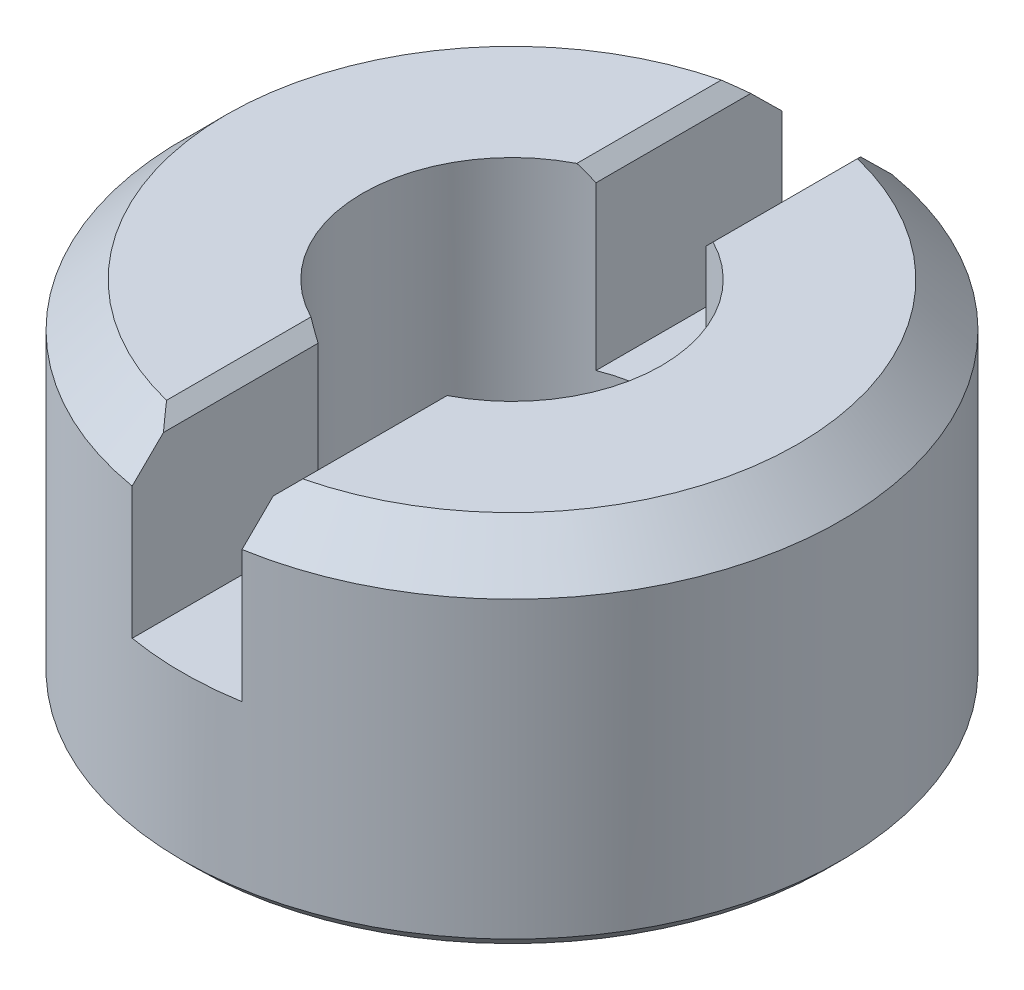
ISO-10303-21;
HEADER;
FILE_DESCRIPTION(('STEP AP214'),'2;1');
FILE_NAME('part.step','',(''),(''),'','','');
FILE_SCHEMA(('AUTOMOTIVE_DESIGN { 1 0 10303 214 1 1 1 1 }'));
ENDSEC;
DATA;
#1=APPLICATION_CONTEXT('core data for automotive mechanical design processes');
#2=APPLICATION_PROTOCOL_DEFINITION('international standard','automotive_design',2000,#1);
#3=PRODUCT_CONTEXT('',#1,'mechanical');
#4=PRODUCT('Part','Part','',(#3));
#5=PRODUCT_RELATED_PRODUCT_CATEGORY('part','',(#4));
#6=PRODUCT_DEFINITION_FORMATION('','',#4);
#7=PRODUCT_DEFINITION_CONTEXT('part definition',#1,'design');
#8=PRODUCT_DEFINITION('design','',#6,#7);
#9=PRODUCT_DEFINITION_SHAPE('','',#8);
#10=(LENGTH_UNIT() NAMED_UNIT(*) SI_UNIT(.MILLI.,.METRE.));
#11=(NAMED_UNIT(*) PLANE_ANGLE_UNIT() SI_UNIT($,.RADIAN.));
#12=(NAMED_UNIT(*) SI_UNIT($,.STERADIAN.) SOLID_ANGLE_UNIT());
#13=UNCERTAINTY_MEASURE_WITH_UNIT(LENGTH_MEASURE(1.E-05),#10,'distance_accuracy_value','');
#14=(GEOMETRIC_REPRESENTATION_CONTEXT(3) GLOBAL_UNCERTAINTY_ASSIGNED_CONTEXT((#13)) GLOBAL_UNIT_ASSIGNED_CONTEXT((#10,
#11,#12)) REPRESENTATION_CONTEXT('',''));
#15=CARTESIAN_POINT('',(0.,0.,0.));
#16=DIRECTION('',(0.,0.,1.));
#17=DIRECTION('',(1.,0.,0.));
#18=AXIS2_PLACEMENT_3D('',#15,#16,#17);
#19=CARTESIAN_POINT('',(0.,0.,0.));
#20=DIRECTION('',(0.,1.,0.));
#21=DIRECTION('',(0.,0.,1.));
#22=AXIS2_PLACEMENT_3D('',#19,#20,#21);
#23=PLANE('',#22);
#24=CARTESIAN_POINT('',(0.,0.,0.));
#25=DIRECTION('',(0.,1.,0.));
#26=DIRECTION('',(0.,0.,1.));
#27=AXIS2_PLACEMENT_3D('',#24,#25,#26);
#28=CIRCLE('',#27,1.44);
#29=CARTESIAN_POINT('',(0.,0.,1.44));
#30=VERTEX_POINT('',#29);
#31=EDGE_CURVE('E307',#30,#30,#28,.F.);
#32=ORIENTED_EDGE('',*,*,#31,.T.);
#33=EDGE_LOOP('',(#32));
#34=FACE_BOUND('',#33,.T.);
#35=CARTESIAN_POINT('',(0.,0.,0.));
#36=DIRECTION('',(0.,-1.,0.));
#37=DIRECTION('',(0.,0.,-1.));
#38=AXIS2_PLACEMENT_3D('',#35,#36,#37);
#39=CIRCLE('',#38,0.8);
#40=CARTESIAN_POINT('',(0.,0.,-0.8));
#41=VERTEX_POINT('',#40);
#42=EDGE_CURVE('E418',#41,#41,#39,.T.);
#43=ORIENTED_EDGE('',*,*,#42,.F.);
#44=EDGE_LOOP('',(#43));
#45=FACE_BOUND('',#44,.T.);
#46=ADVANCED_FACE('F30',(#34,#45),#23,.F.);
#47=CARTESIAN_POINT('',(0.,1.6,0.));
#48=DIRECTION('',(0.,-1.,0.));
#49=DIRECTION('',(0.,0.,-1.));
#50=AXIS2_PLACEMENT_3D('',#47,#48,#49);
#51=CYLINDRICAL_SURFACE('',#50,0.68);
#52=CARTESIAN_POINT('',(0.,1.29,0.));
#53=DIRECTION('',(-0.707106781186547,0.707106781186547,0.));
#54=DIRECTION('',(-0.707106781186548,-0.707106781186548,0.));
#55=AXIS2_PLACEMENT_3D('',#52,#53,#54);
#56=ELLIPSE('',#55,0.961665222413705,0.68);
#57=CARTESIAN_POINT('',(0.310000000000001,1.6,-0.60522723005496));
#58=VERTEX_POINT('',#57);
#59=CARTESIAN_POINT('',(0.25,1.54,-0.632376470150495));
#60=VERTEX_POINT('',#59);
#61=EDGE_CURVE('E135',#58,#60,#56,.T.);
#62=ORIENTED_EDGE('',*,*,#61,.T.);
#63=DIRECTION('',(0.,-1.,0.));
#64=VECTOR('',#63,1.);
#65=CARTESIAN_POINT('',(0.25,1.6,-0.632376470150495));
#66=LINE('',#65,#64);
#67=CARTESIAN_POINT('',(0.25,0.8,-0.632376470150495));
#68=VERTEX_POINT('',#67);
#69=EDGE_CURVE('E152',#68,#60,#66,.F.);
#70=ORIENTED_EDGE('',*,*,#69,.F.);
#71=CARTESIAN_POINT('',(0.,0.8,0.));
#72=DIRECTION('',(0.,-1.,0.));
#73=DIRECTION('',(0.,0.,-1.));
#74=AXIS2_PLACEMENT_3D('',#71,#72,#73);
#75=CIRCLE('',#74,0.68);
#76=CARTESIAN_POINT('',(-0.25,0.8,-0.632376470150495));
#77=VERTEX_POINT('',#76);
#78=EDGE_CURVE('E412',#77,#68,#75,.T.);
#79=ORIENTED_EDGE('',*,*,#78,.F.);
#80=DIRECTION('',(0.,-1.,0.));
#81=VECTOR('',#80,1.);
#82=CARTESIAN_POINT('',(-0.25,1.6,-0.632376470150495));
#83=LINE('',#82,#81);
#84=CARTESIAN_POINT('',(-0.25,1.54,-0.632376470150495));
#85=VERTEX_POINT('',#84);
#86=EDGE_CURVE('E272',#85,#77,#83,.T.);
#87=ORIENTED_EDGE('',*,*,#86,.F.);
#88=CARTESIAN_POINT('',(0.,1.29,0.));
#89=DIRECTION('',(0.707106781186547,0.707106781186547,0.));
#90=DIRECTION('',(0.707106781186548,-0.707106781186548,0.));
#91=AXIS2_PLACEMENT_3D('',#88,#89,#90);
#92=ELLIPSE('',#91,0.961665222413705,0.68);
#93=CARTESIAN_POINT('',(-0.310000000000001,1.6,-0.60522723005496));
#94=VERTEX_POINT('',#93);
#95=EDGE_CURVE('E12',#85,#94,#92,.T.);
#96=ORIENTED_EDGE('',*,*,#95,.T.);
#97=CARTESIAN_POINT('',(0.,1.6,0.));
#98=DIRECTION('',(0.,-1.,0.));
#99=DIRECTION('',(0.,0.,-1.));
#100=AXIS2_PLACEMENT_3D('',#97,#98,#99);
#101=CIRCLE('',#100,0.68);
#102=CARTESIAN_POINT('',(-0.310000000000001,1.6,0.60522723005496));
#103=VERTEX_POINT('',#102);
#104=EDGE_CURVE('E45',#103,#94,#101,.T.);
#105=ORIENTED_EDGE('',*,*,#104,.F.);
#106=CARTESIAN_POINT('',(-0.25,1.54,0.632376470150495));
#107=VERTEX_POINT('',#106);
#108=EDGE_CURVE('E39',#103,#107,#92,.T.);
#109=ORIENTED_EDGE('',*,*,#108,.T.);
#110=DIRECTION('',(0.,-1.,0.));
#111=VECTOR('',#110,1.);
#112=CARTESIAN_POINT('',(-0.25,1.6,0.632376470150495));
#113=LINE('',#112,#111);
#114=CARTESIAN_POINT('',(-0.25,0.8,0.632376470150495));
#115=VERTEX_POINT('',#114);
#116=EDGE_CURVE('E142',#115,#107,#113,.F.);
#117=ORIENTED_EDGE('',*,*,#116,.F.);
#118=CARTESIAN_POINT('',(0.25,0.8,0.632376470150495));
#119=VERTEX_POINT('',#118);
#120=EDGE_CURVE('E415',#119,#115,#75,.T.);
#121=ORIENTED_EDGE('',*,*,#120,.F.);
#122=DIRECTION('',(0.,-1.,0.));
#123=VECTOR('',#122,1.);
#124=CARTESIAN_POINT('',(0.25,1.6,0.632376470150495));
#125=LINE('',#124,#123);
#126=CARTESIAN_POINT('',(0.25,1.54,0.632376470150495));
#127=VERTEX_POINT('',#126);
#128=EDGE_CURVE('E409',#127,#119,#125,.T.);
#129=ORIENTED_EDGE('',*,*,#128,.F.);
#130=CARTESIAN_POINT('',(0.310000000000001,1.6,0.60522723005496));
#131=VERTEX_POINT('',#130);
#132=EDGE_CURVE('E138',#127,#131,#56,.T.);
#133=ORIENTED_EDGE('',*,*,#132,.T.);
#134=EDGE_CURVE('E131',#58,#131,#101,.T.);
#135=ORIENTED_EDGE('',*,*,#134,.F.);
#136=EDGE_LOOP('',(#62,#70,#79,#87,#96,#105,#109,#117,#121,#129,#133,#135));
#137=FACE_BOUND('',#136,.T.);
#138=CARTESIAN_POINT('',(0.,0.0692820323027542,0.));
#139=DIRECTION('',(0.,-1.,0.));
#140=DIRECTION('',(0.,0.,-1.));
#141=AXIS2_PLACEMENT_3D('',#138,#139,#140);
#142=CIRCLE('',#141,0.68);
#143=CARTESIAN_POINT('',(0.,0.0692820323027542,-0.68));
#144=VERTEX_POINT('',#143);
#145=EDGE_CURVE('E34',#144,#144,#142,.F.);
#146=ORIENTED_EDGE('',*,*,#145,.F.);
#147=EDGE_LOOP('',(#146));
#148=FACE_BOUND('',#147,.T.);
#149=ADVANCED_FACE('F133',(#137,#148),#51,.F.);
#150=CARTESIAN_POINT('',(0.25,0.8,1.5));
#151=DIRECTION('',(0.,-1.,0.));
#152=DIRECTION('',(0.,0.,-1.));
#153=AXIS2_PLACEMENT_3D('',#150,#151,#152);
#154=PLANE('',#153);
#155=DIRECTION('',(0.,0.,-1.));
#156=VECTOR('',#155,1.);
#157=CARTESIAN_POINT('',(0.25,0.8,-1.5));
#158=LINE('',#157,#156);
#159=CARTESIAN_POINT('',(0.25,0.8,1.47901994577491));
#160=VERTEX_POINT('',#159);
#161=EDGE_CURVE('E408',#160,#119,#158,.T.);
#162=ORIENTED_EDGE('',*,*,#161,.T.);
#163=ORIENTED_EDGE('',*,*,#120,.T.);
#164=DIRECTION('',(0.,0.,1.));
#165=VECTOR('',#164,1.);
#166=CARTESIAN_POINT('',(-0.25,0.8,-1.5));
#167=LINE('',#166,#165);
#168=CARTESIAN_POINT('',(-0.25,0.8,1.47901994577491));
#169=VERTEX_POINT('',#168);
#170=EDGE_CURVE('E394',#115,#169,#167,.T.);
#171=ORIENTED_EDGE('',*,*,#170,.T.);
#172=CARTESIAN_POINT('',(0.,0.8,0.));
#173=DIRECTION('',(0.,-1.,0.));
#174=DIRECTION('',(0.,0.,-1.));
#175=AXIS2_PLACEMENT_3D('',#172,#173,#174);
#176=CIRCLE('',#175,1.5);
#177=EDGE_CURVE('E284',#160,#169,#176,.T.);
#178=ORIENTED_EDGE('',*,*,#177,.F.);
#179=EDGE_LOOP('',(#162,#163,#171,#178));
#180=FACE_BOUND('',#179,.T.);
#181=ADVANCED_FACE('F251',(#180),#154,.F.);
#182=CARTESIAN_POINT('',(0.25,0.8,-1.5));
#183=DIRECTION('',(1.,0.,0.));
#184=DIRECTION('',(0.,0.,-1.));
#185=AXIS2_PLACEMENT_3D('',#182,#183,#184);
#186=PLANE('',#185);
#187=DIRECTION('',(0.,0.,-1.));
#188=VECTOR('',#187,1.);
#189=CARTESIAN_POINT('',(0.25,1.54,-1.27573508221731));
#190=LINE('',#189,#188);
#191=CARTESIAN_POINT('',(0.25,1.54,1.336824595824));
#192=VERTEX_POINT('',#191);
#193=EDGE_CURVE('E207',#192,#127,#190,.T.);
#194=ORIENTED_EDGE('',*,*,#193,.T.);
#195=ORIENTED_EDGE('',*,*,#128,.T.);
#196=ORIENTED_EDGE('',*,*,#161,.F.);
#197=DIRECTION('',(0.,-1.,0.));
#198=VECTOR('',#197,1.);
#199=CARTESIAN_POINT('',(0.25,1.6,1.47901994577491));
#200=LINE('',#199,#198);
#201=CARTESIAN_POINT('',(0.25,1.4,1.47901994577491));
#202=VERTEX_POINT('',#201);
#203=EDGE_CURVE('E304',#202,#160,#200,.T.);
#204=ORIENTED_EDGE('',*,*,#203,.F.);
#205=CARTESIAN_POINT('',(0.25,1.4,1.47901994577491));
#206=CARTESIAN_POINT('',(0.25,1.43337340142529,1.44517855748232));
#207=CARTESIAN_POINT('',(0.25,1.46672676838881,1.41131745846318));
#208=CARTESIAN_POINT('',(0.25,1.53339343505748,1.34355583727929));
#209=CARTESIAN_POINT('',(0.25,1.56670673476063,1.30965531511255));
#210=CARTESIAN_POINT('',(0.25,1.6,1.27573508221731));
#211=B_SPLINE_CURVE_WITH_KNOTS('',3,(#205,#206,#207,#208,#209,#210),.UNSPECIFIED.,.F.,.F.,(4,2,
4),(0.,0.142587482028677,0.285174971180432),.UNSPECIFIED.);
#212=EDGE_CURVE('E216',#202,#192,#211,.T.);
#213=ORIENTED_EDGE('',*,*,#212,.T.);
#214=EDGE_LOOP('',(#194,#195,#196,#204,#213));
#215=FACE_BOUND('',#214,.T.);
#216=ADVANCED_FACE('F238',(#215),#186,.F.);
#217=CARTESIAN_POINT('',(-0.25,0.8,-1.5));
#218=DIRECTION('',(-1.,0.,0.));
#219=DIRECTION('',(0.,0.,1.));
#220=AXIS2_PLACEMENT_3D('',#217,#218,#219);
#221=PLANE('',#220);
#222=DIRECTION('',(0.,0.,1.));
#223=VECTOR('',#222,1.);
#224=CARTESIAN_POINT('',(-0.25,1.54,1.27573508221731));
#225=LINE('',#224,#223);
#226=CARTESIAN_POINT('',(-0.25,1.54,-1.336824595824));
#227=VERTEX_POINT('',#226);
#228=EDGE_CURVE('E161',#227,#85,#225,.T.);
#229=ORIENTED_EDGE('',*,*,#228,.T.);
#230=ORIENTED_EDGE('',*,*,#86,.T.);
#231=CARTESIAN_POINT('',(-0.25,0.8,-1.47901994577491));
#232=VERTEX_POINT('',#231);
#233=EDGE_CURVE('E390',#232,#77,#167,.T.);
#234=ORIENTED_EDGE('',*,*,#233,.F.);
#235=DIRECTION('',(0.,-1.,0.));
#236=VECTOR('',#235,1.);
#237=CARTESIAN_POINT('',(-0.25,1.6,-1.47901994577491));
#238=LINE('',#237,#236);
#239=CARTESIAN_POINT('',(-0.25,1.4,-1.47901994577491));
#240=VERTEX_POINT('',#239);
#241=EDGE_CURVE('E277',#240,#232,#238,.T.);
#242=ORIENTED_EDGE('',*,*,#241,.F.);
#243=CARTESIAN_POINT('',(-0.25,1.4,-1.47901994577491));
#244=CARTESIAN_POINT('',(-0.25,1.43337340142529,-1.44517855748232));
#245=CARTESIAN_POINT('',(-0.25,1.46672676838881,-1.41131745846318));
#246=CARTESIAN_POINT('',(-0.25,1.53339343505748,-1.34355583727929));
#247=CARTESIAN_POINT('',(-0.25,1.56670673476063,-1.30965531511255));
#248=CARTESIAN_POINT('',(-0.25,1.6,-1.27573508221731));
#249=B_SPLINE_CURVE_WITH_KNOTS('',3,(#243,#244,#245,#246,#247,#248),.UNSPECIFIED.,.F.,.F.,(4,2,
4),(0.,0.142587482028677,0.285174971180432),.UNSPECIFIED.);
#250=EDGE_CURVE('E276',#240,#227,#249,.T.);
#251=ORIENTED_EDGE('',*,*,#250,.T.);
#252=EDGE_LOOP('',(#229,#230,#234,#242,#251));
#253=FACE_BOUND('',#252,.T.);
#254=ADVANCED_FACE('F261',(#253),#221,.F.);
#255=CARTESIAN_POINT('',(0.25,1.54,-1.5));
#256=DIRECTION('',(-0.707106781186547,0.707106781186547,0.));
#257=DIRECTION('',(-0.707106781186548,-0.707106781186548,0.));
#258=AXIS2_PLACEMENT_3D('',#255,#256,#257);
#259=PLANE('',#258);
#260=ORIENTED_EDGE('',*,*,#132,.F.);
#261=ORIENTED_EDGE('',*,*,#193,.F.);
#262=CARTESIAN_POINT('',(0.310000000000001,1.6,1.26249752475005));
#263=CARTESIAN_POINT('',(0.30012412869499,1.59012412869499,1.27508580627351));
#264=CARTESIAN_POINT('',(0.290186187307234,1.58018618730723,1.28757387652882));
#265=CARTESIAN_POINT('',(0.270186187025936,1.56018618702594,1.31234956643265));
#266=CARTESIAN_POINT('',(0.260124128413692,1.55012412841369,1.32463718653533));
#267=CARTESIAN_POINT('',(0.25,1.54,1.336824595824));
#268=B_SPLINE_CURVE_WITH_KNOTS('',3,(#262,#263,#264,#265,#266,#267),.UNSPECIFIED.,.F.,.F.,(4,2,
4),(0.,0.0564029725350605,0.112805817262793),.UNSPECIFIED.);
#269=CARTESIAN_POINT('',(0.310000000000001,1.6,1.26249752475005));
#270=VERTEX_POINT('',#269);
#271=EDGE_CURVE('E202',#270,#192,#268,.T.);
#272=ORIENTED_EDGE('',*,*,#271,.F.);
#273=DIRECTION('',(0.,0.,1.));
#274=VECTOR('',#273,1.);
#275=CARTESIAN_POINT('',(0.310000000000001,1.6,1.27573508221731));
#276=LINE('',#275,#274);
#277=EDGE_CURVE('E159',#131,#270,#276,.T.);
#278=ORIENTED_EDGE('',*,*,#277,.F.);
#279=EDGE_LOOP('',(#260,#261,#272,#278));
#280=FACE_BOUND('',#279,.T.);
#281=ADVANCED_FACE('F200',(#280),#259,.T.);
#282=CARTESIAN_POINT('',(-0.25,1.54,-1.5));
#283=DIRECTION('',(0.707106781186547,0.707106781186547,0.));
#284=DIRECTION('',(-0.707106781186548,0.707106781186548,0.));
#285=AXIS2_PLACEMENT_3D('',#282,#283,#284);
#286=PLANE('',#285);
#287=ORIENTED_EDGE('',*,*,#95,.F.);
#288=ORIENTED_EDGE('',*,*,#228,.F.);
#289=CARTESIAN_POINT('',(-0.310000000000001,1.6,-1.26249752475005));
#290=CARTESIAN_POINT('',(-0.30012412869499,1.59012412869499,-1.27508580627351));
#291=CARTESIAN_POINT('',(-0.290186187307234,1.58018618730723,-1.28757387652882));
#292=CARTESIAN_POINT('',(-0.270186187025936,1.56018618702594,-1.31234956643265));
#293=CARTESIAN_POINT('',(-0.260124128413692,1.55012412841369,-1.32463718653533));
#294=CARTESIAN_POINT('',(-0.25,1.54,-1.336824595824));
#295=B_SPLINE_CURVE_WITH_KNOTS('',3,(#289,#290,#291,#292,#293,#294),.UNSPECIFIED.,.F.,.F.,(4,2,
4),(0.,0.0564029725350605,0.112805817262793),.UNSPECIFIED.);
#296=CARTESIAN_POINT('',(-0.310000000000001,1.6,-1.26249752475005));
#297=VERTEX_POINT('',#296);
#298=EDGE_CURVE('E173',#297,#227,#295,.T.);
#299=ORIENTED_EDGE('',*,*,#298,.F.);
#300=DIRECTION('',(0.,0.,-1.));
#301=VECTOR('',#300,1.);
#302=CARTESIAN_POINT('',(-0.310000000000001,1.6,-1.27573508221731));
#303=LINE('',#302,#301);
#304=EDGE_CURVE('E267',#94,#297,#303,.T.);
#305=ORIENTED_EDGE('',*,*,#304,.F.);
#306=EDGE_LOOP('',(#287,#288,#299,#305));
#307=FACE_BOUND('',#306,.T.);
#308=ADVANCED_FACE('F193',(#307),#286,.T.);
#309=CARTESIAN_POINT('',(0.,1.6,0.));
#310=DIRECTION('',(0.,1.,0.));
#311=DIRECTION('',(0.,0.,1.));
#312=AXIS2_PLACEMENT_3D('',#309,#310,#311);
#313=PLANE('',#312);
#314=ORIENTED_EDGE('',*,*,#134,.T.);
#315=ORIENTED_EDGE('',*,*,#277,.T.);
#316=CARTESIAN_POINT('',(0.,1.6,0.));
#317=DIRECTION('',(0.,1.,0.));
#318=DIRECTION('',(0.,0.,1.));
#319=AXIS2_PLACEMENT_3D('',#316,#317,#318);
#320=CIRCLE('',#319,1.3);
#321=CARTESIAN_POINT('',(0.310000000000001,1.6,-1.26249752475005));
#322=VERTEX_POINT('',#321);
#323=EDGE_CURVE('E157',#270,#322,#320,.T.);
#324=ORIENTED_EDGE('',*,*,#323,.T.);
#325=EDGE_CURVE('E149',#322,#58,#276,.T.);
#326=ORIENTED_EDGE('',*,*,#325,.T.);
#327=EDGE_LOOP('',(#314,#315,#324,#326));
#328=FACE_BOUND('',#327,.T.);
#329=ADVANCED_FACE('F155',(#328),#313,.T.);
#330=CARTESIAN_POINT('',(0.,1.6,0.));
#331=DIRECTION('',(0.,-1.,0.));
#332=DIRECTION('',(0.,0.,-1.));
#333=AXIS2_PLACEMENT_3D('',#330,#331,#332);
#334=CYLINDRICAL_SURFACE('',#333,1.5);
#335=CARTESIAN_POINT('',(0.,0.0599999999999995,0.));
#336=DIRECTION('',(0.,1.,0.));
#337=DIRECTION('',(0.,0.,1.));
#338=AXIS2_PLACEMENT_3D('',#335,#336,#337);
#339=CIRCLE('',#338,1.5);
#340=CARTESIAN_POINT('',(0.,0.0599999999999995,1.5));
#341=VERTEX_POINT('',#340);
#342=EDGE_CURVE('E229',#341,#341,#339,.T.);
#343=ORIENTED_EDGE('',*,*,#342,.T.);
#344=EDGE_LOOP('',(#343));
#345=FACE_BOUND('',#344,.T.);
#346=DIRECTION('',(0.,-1.,0.));
#347=VECTOR('',#346,1.);
#348=CARTESIAN_POINT('',(-0.25,1.6,1.47901994577491));
#349=LINE('',#348,#347);
#350=CARTESIAN_POINT('',(-0.25,1.4,1.47901994577491));
#351=VERTEX_POINT('',#350);
#352=EDGE_CURVE('E385',#169,#351,#349,.F.);
#353=ORIENTED_EDGE('',*,*,#352,.T.);
#354=CARTESIAN_POINT('',(0.,1.4,0.));
#355=DIRECTION('',(0.,1.,0.));
#356=DIRECTION('',(0.,0.,1.));
#357=AXIS2_PLACEMENT_3D('',#354,#355,#356);
#358=CIRCLE('',#357,1.5);
#359=EDGE_CURVE('E295',#351,#240,#358,.F.);
#360=ORIENTED_EDGE('',*,*,#359,.T.);
#361=ORIENTED_EDGE('',*,*,#241,.T.);
#362=CARTESIAN_POINT('',(0.25,0.8,-1.47901994577491));
#363=VERTEX_POINT('',#362);
#364=EDGE_CURVE('E400',#232,#363,#176,.T.);
#365=ORIENTED_EDGE('',*,*,#364,.T.);
#366=DIRECTION('',(0.,-1.,0.));
#367=VECTOR('',#366,1.);
#368=CARTESIAN_POINT('',(0.25,1.6,-1.47901994577491));
#369=LINE('',#368,#367);
#370=CARTESIAN_POINT('',(0.25,1.4,-1.47901994577491));
#371=VERTEX_POINT('',#370);
#372=EDGE_CURVE('E392',#363,#371,#369,.F.);
#373=ORIENTED_EDGE('',*,*,#372,.T.);
#374=CARTESIAN_POINT('',(0.,1.4,0.));
#375=DIRECTION('',(0.,1.,0.));
#376=DIRECTION('',(0.,0.,1.));
#377=AXIS2_PLACEMENT_3D('',#374,#375,#376);
#378=CIRCLE('',#377,1.5);
#379=EDGE_CURVE('E282',#371,#202,#378,.F.);
#380=ORIENTED_EDGE('',*,*,#379,.T.);
#381=ORIENTED_EDGE('',*,*,#203,.T.);
#382=ORIENTED_EDGE('',*,*,#177,.T.);
#383=EDGE_LOOP('',(#353,#360,#361,#365,#373,#380,#381,#382));
#384=FACE_BOUND('',#383,.T.);
#385=ADVANCED_FACE('F32',(#345,#384),#334,.T.);
#386=ORIENTED_EDGE('',*,*,#104,.T.);
#387=ORIENTED_EDGE('',*,*,#304,.T.);
#388=CARTESIAN_POINT('',(0.,1.6,0.));
#389=DIRECTION('',(0.,1.,0.));
#390=DIRECTION('',(0.,0.,1.));
#391=AXIS2_PLACEMENT_3D('',#388,#389,#390);
#392=CIRCLE('',#391,1.3);
#393=CARTESIAN_POINT('',(-0.310000000000001,1.6,1.26249752475005));
#394=VERTEX_POINT('',#393);
#395=EDGE_CURVE('E280',#297,#394,#392,.T.);
#396=ORIENTED_EDGE('',*,*,#395,.T.);
#397=EDGE_CURVE('E427',#394,#103,#303,.T.);
#398=ORIENTED_EDGE('',*,*,#397,.T.);
#399=EDGE_LOOP('',(#386,#387,#396,#398));
#400=FACE_BOUND('',#399,.T.);
#401=ADVANCED_FACE('F243',(#400),#313,.T.);
#402=ORIENTED_EDGE('',*,*,#233,.T.);
#403=ORIENTED_EDGE('',*,*,#78,.T.);
#404=EDGE_CURVE('E151',#68,#363,#158,.T.);
#405=ORIENTED_EDGE('',*,*,#404,.T.);
#406=ORIENTED_EDGE('',*,*,#364,.F.);
#407=EDGE_LOOP('',(#402,#403,#405,#406));
#408=FACE_BOUND('',#407,.T.);
#409=ADVANCED_FACE('F236',(#408),#154,.F.);
#410=ORIENTED_EDGE('',*,*,#404,.F.);
#411=ORIENTED_EDGE('',*,*,#69,.T.);
#412=CARTESIAN_POINT('',(0.25,1.54,-1.336824595824));
#413=VERTEX_POINT('',#412);
#414=EDGE_CURVE('E150',#60,#413,#190,.T.);
#415=ORIENTED_EDGE('',*,*,#414,.T.);
#416=CARTESIAN_POINT('',(0.25,1.6,-1.27573508221731));
#417=CARTESIAN_POINT('',(0.25,1.56670673476063,-1.30965531511255));
#418=CARTESIAN_POINT('',(0.25,1.53339343505748,-1.34355583727929));
#419=CARTESIAN_POINT('',(0.25,1.46672676838881,-1.41131745846318));
#420=CARTESIAN_POINT('',(0.25,1.43337340142529,-1.44517855748232));
#421=CARTESIAN_POINT('',(0.25,1.4,-1.47901994577491));
#422=B_SPLINE_CURVE_WITH_KNOTS('',3,(#416,#417,#418,#419,#420,#421),.UNSPECIFIED.,.F.,.F.,(4,2,
4),(0.,0.142587489151755,0.285174971180432),.UNSPECIFIED.);
#423=EDGE_CURVE('E224',#413,#371,#422,.T.);
#424=ORIENTED_EDGE('',*,*,#423,.T.);
#425=ORIENTED_EDGE('',*,*,#372,.F.);
#426=EDGE_LOOP('',(#410,#411,#415,#424,#425));
#427=FACE_BOUND('',#426,.T.);
#428=ADVANCED_FACE('F230',(#427),#186,.F.);
#429=ORIENTED_EDGE('',*,*,#170,.F.);
#430=ORIENTED_EDGE('',*,*,#116,.T.);
#431=CARTESIAN_POINT('',(-0.25,1.54,1.336824595824));
#432=VERTEX_POINT('',#431);
#433=EDGE_CURVE('E158',#107,#432,#225,.T.);
#434=ORIENTED_EDGE('',*,*,#433,.T.);
#435=CARTESIAN_POINT('',(-0.25,1.6,1.27573508221731));
#436=CARTESIAN_POINT('',(-0.25,1.56670673476063,1.30965531511255));
#437=CARTESIAN_POINT('',(-0.25,1.53339343505748,1.34355583727929));
#438=CARTESIAN_POINT('',(-0.25,1.46672676838881,1.41131745846318));
#439=CARTESIAN_POINT('',(-0.25,1.43337340142529,1.44517855748232));
#440=CARTESIAN_POINT('',(-0.25,1.4,1.47901994577491));
#441=B_SPLINE_CURVE_WITH_KNOTS('',3,(#435,#436,#437,#438,#439,#440),.UNSPECIFIED.,.F.,.F.,(4,2,
4),(0.,0.142587489151755,0.285174971180432),.UNSPECIFIED.);
#442=EDGE_CURVE('E279',#432,#351,#441,.T.);
#443=ORIENTED_EDGE('',*,*,#442,.T.);
#444=ORIENTED_EDGE('',*,*,#352,.F.);
#445=EDGE_LOOP('',(#429,#430,#434,#443,#444));
#446=FACE_BOUND('',#445,.T.);
#447=ADVANCED_FACE('F235',(#446),#221,.F.);
#448=CARTESIAN_POINT('',(0.,1.6,0.));
#449=DIRECTION('',(0.,-1.,0.));
#450=DIRECTION('',(0.,0.,-1.));
#451=AXIS2_PLACEMENT_3D('',#448,#449,#450);
#452=CONICAL_SURFACE('',#451,1.3,0.785398163397447);
#453=ORIENTED_EDGE('',*,*,#442,.F.);
#454=CARTESIAN_POINT('',(-0.25,1.54,1.336824595824));
#455=CARTESIAN_POINT('',(-0.260124128413692,1.55012412841369,1.32463718653533));
#456=CARTESIAN_POINT('',(-0.270186187025936,1.56018618702594,1.31234956643265));
#457=CARTESIAN_POINT('',(-0.290186187307234,1.58018618730723,1.28757387652882));
#458=CARTESIAN_POINT('',(-0.30012412869499,1.59012412869499,1.27508580627351));
#459=CARTESIAN_POINT('',(-0.310000000000001,1.6,1.26249752475005));
#460=B_SPLINE_CURVE_WITH_KNOTS('',3,(#454,#455,#456,#457,#458,#459),.UNSPECIFIED.,.F.,.F.,(4,2,
4),(0.,0.056402844727733,0.112805817262793),.UNSPECIFIED.);
#461=EDGE_CURVE('E53',#432,#394,#460,.T.);
#462=ORIENTED_EDGE('',*,*,#461,.T.);
#463=ORIENTED_EDGE('',*,*,#395,.F.);
#464=ORIENTED_EDGE('',*,*,#298,.T.);
#465=ORIENTED_EDGE('',*,*,#250,.F.);
#466=ORIENTED_EDGE('',*,*,#359,.F.);
#467=EDGE_LOOP('',(#453,#462,#463,#464,#465,#466));
#468=FACE_BOUND('',#467,.T.);
#469=ADVANCED_FACE('F184',(#468),#452,.T.);
#470=CARTESIAN_POINT('',(0.,1.6,0.));
#471=DIRECTION('',(0.,-1.,0.));
#472=DIRECTION('',(0.,0.,-1.));
#473=AXIS2_PLACEMENT_3D('',#470,#471,#472);
#474=CONICAL_SURFACE('',#473,1.3,0.785398163397447);
#475=ORIENTED_EDGE('',*,*,#423,.F.);
#476=CARTESIAN_POINT('',(0.25,1.54,-1.336824595824));
#477=CARTESIAN_POINT('',(0.260124128413692,1.55012412841369,-1.32463718653533));
#478=CARTESIAN_POINT('',(0.270186187025936,1.56018618702594,-1.31234956643265));
#479=CARTESIAN_POINT('',(0.290186187307234,1.58018618730723,-1.28757387652882));
#480=CARTESIAN_POINT('',(0.30012412869499,1.59012412869499,-1.27508580627351));
#481=CARTESIAN_POINT('',(0.310000000000001,1.6,-1.26249752475005));
#482=B_SPLINE_CURVE_WITH_KNOTS('',3,(#476,#477,#478,#479,#480,#481),.UNSPECIFIED.,.F.,.F.,(4,2,
4),(0.,0.056402844727733,0.112805817262793),.UNSPECIFIED.);
#483=EDGE_CURVE('E163',#413,#322,#482,.T.);
#484=ORIENTED_EDGE('',*,*,#483,.T.);
#485=ORIENTED_EDGE('',*,*,#323,.F.);
#486=ORIENTED_EDGE('',*,*,#271,.T.);
#487=ORIENTED_EDGE('',*,*,#212,.F.);
#488=ORIENTED_EDGE('',*,*,#379,.F.);
#489=EDGE_LOOP('',(#475,#484,#485,#486,#487,#488));
#490=FACE_BOUND('',#489,.T.);
#491=ADVANCED_FACE('F209',(#490),#474,.T.);
#492=CARTESIAN_POINT('',(0.,0.0599999999999995,0.));
#493=DIRECTION('',(0.,1.,0.));
#494=DIRECTION('',(0.,0.,1.));
#495=AXIS2_PLACEMENT_3D('',#492,#493,#494);
#496=CONICAL_SURFACE('',#495,1.5,0.78539816339745);
#497=CARTESIAN_POINT('',(0.,0.,1.44));
#498=CARTESIAN_POINT('',(0.,0.000625000000000041,1.440625));
#499=CARTESIAN_POINT('',(0.,0.00125000000000002,1.44125));
#500=CARTESIAN_POINT('',(0.,0.00249999999999997,1.4425));
#501=CARTESIAN_POINT('',(0.,0.00312499999999995,1.443125));
#502=CARTESIAN_POINT('',(0.,0.00437499999999994,1.444375));
#503=CARTESIAN_POINT('',(0.,0.00499999999999995,1.445));
#504=CARTESIAN_POINT('',(0.,0.00624999999999995,1.44625));
#505=CARTESIAN_POINT('',(0.,0.00687499999999993,1.446875));
#506=CARTESIAN_POINT('',(0.,0.00812499999999993,1.448125));
#507=CARTESIAN_POINT('',(0.,0.00874999999999994,1.44875));
#508=CARTESIAN_POINT('',(0.,0.00999999999999992,1.45));
#509=CARTESIAN_POINT('',(0.,0.0106249999999999,1.450625));
#510=CARTESIAN_POINT('',(0.,0.0118749999999999,1.451875));
#511=CARTESIAN_POINT('',(0.,0.0124999999999999,1.4525));
#512=CARTESIAN_POINT('',(0.,0.0137499999999999,1.45375));
#513=CARTESIAN_POINT('',(0.,0.0143749999999999,1.454375));
#514=CARTESIAN_POINT('',(0.,0.0156249999999999,1.455625));
#515=CARTESIAN_POINT('',(0.,0.0162499999999999,1.45625));
#516=CARTESIAN_POINT('',(0.,0.0174999999999998,1.4575));
#517=CARTESIAN_POINT('',(0.,0.0181249999999998,1.458125));
#518=CARTESIAN_POINT('',(0.,0.0193749999999998,1.459375));
#519=CARTESIAN_POINT('',(0.,0.0199999999999999,1.46));
#520=CARTESIAN_POINT('',(0.,0.0212499999999998,1.46125));
#521=CARTESIAN_POINT('',(0.,0.0218749999999998,1.461875));
#522=CARTESIAN_POINT('',(0.,0.0231249999999998,1.463125));
#523=CARTESIAN_POINT('',(0.,0.0237499999999998,1.46375));
#524=CARTESIAN_POINT('',(0.,0.0249999999999998,1.465));
#525=CARTESIAN_POINT('',(0.,0.0256249999999998,1.465625));
#526=CARTESIAN_POINT('',(0.,0.0268749999999998,1.466875));
#527=CARTESIAN_POINT('',(0.,0.0274999999999998,1.4675));
#528=CARTESIAN_POINT('',(0.,0.0287499999999997,1.46875));
#529=CARTESIAN_POINT('',(0.,0.0293749999999997,1.469375));
#530=CARTESIAN_POINT('',(0.,0.0306249999999998,1.470625));
#531=CARTESIAN_POINT('',(0.,0.0312499999999998,1.47125));
#532=CARTESIAN_POINT('',(0.,0.0324999999999997,1.4725));
#533=CARTESIAN_POINT('',(0.,0.0331249999999997,1.473125));
#534=CARTESIAN_POINT('',(0.,0.0343749999999997,1.474375));
#535=CARTESIAN_POINT('',(0.,0.0349999999999997,1.475));
#536=CARTESIAN_POINT('',(0.,0.0362499999999997,1.47625));
#537=CARTESIAN_POINT('',(0.,0.0368749999999997,1.476875));
#538=CARTESIAN_POINT('',(0.,0.0381249999999997,1.478125));
#539=CARTESIAN_POINT('',(0.,0.0387499999999997,1.47875));
#540=CARTESIAN_POINT('',(0.,0.0399999999999996,1.48));
#541=CARTESIAN_POINT('',(0.,0.0406249999999997,1.480625));
#542=CARTESIAN_POINT('',(0.,0.0418749999999997,1.481875));
#543=CARTESIAN_POINT('',(0.,0.0424999999999996,1.4825));
#544=CARTESIAN_POINT('',(0.,0.0437499999999996,1.48375));
#545=CARTESIAN_POINT('',(0.,0.0443749999999997,1.484375));
#546=CARTESIAN_POINT('',(0.,0.0456249999999996,1.485625));
#547=CARTESIAN_POINT('',(0.,0.0462499999999996,1.48625));
#548=CARTESIAN_POINT('',(0.,0.0474999999999996,1.4875));
#549=CARTESIAN_POINT('',(0.,0.0481249999999996,1.488125));
#550=CARTESIAN_POINT('',(0.,0.0493749999999996,1.489375));
#551=CARTESIAN_POINT('',(0.,0.0499999999999996,1.49));
#552=CARTESIAN_POINT('',(0.,0.0512499999999996,1.49125));
#553=CARTESIAN_POINT('',(0.,0.0518749999999996,1.491875));
#554=CARTESIAN_POINT('',(0.,0.0531249999999995,1.493125));
#555=CARTESIAN_POINT('',(0.,0.0537499999999995,1.49375));
#556=CARTESIAN_POINT('',(0.,0.0549999999999996,1.495));
#557=CARTESIAN_POINT('',(0.,0.0556249999999996,1.495625));
#558=CARTESIAN_POINT('',(0.,0.0568749999999995,1.496875));
#559=CARTESIAN_POINT('',(0.,0.0574999999999995,1.4975));
#560=CARTESIAN_POINT('',(0.,0.0587499999999995,1.49875));
#561=CARTESIAN_POINT('',(0.,0.0593749999999994,1.499375));
#562=CARTESIAN_POINT('',(0.,0.0599999999999995,1.5));
#563=B_SPLINE_CURVE_WITH_KNOTS('',3,(#497,#498,#499,#500,#501,#502,#503,#504,#505,#506,#507,
#508,#509,#510,#511,#512,#513,#514,#515,#516,#517,#518,#519,#520,#521,#522,#523,#524,#525,#526,
#527,#528,#529,#530,#531,#532,#533,#534,#535,#536,#537,#538,#539,#540,#541,#542,#543,#544,#545,
#546,#547,#548,#549,#550,#551,#552,#553,#554,#555,#556,#557,#558,#559,#560,#561,#562),
.UNSPECIFIED.,.F.,.F.,(4,2,2,2,2,2,2,2,2,2,2,2,2,2,2,2,2,2,2,2,2,2,2,2,2,2,2,2,2,2,2,2,4),(0.,
0.00265165042944949,0.00530330085889913,0.00795495128834862,0.0106066017177981,
0.0132582521472476,0.0159099025766972,0.0185615530061467,0.0212132034355962,0.0238648538650459,
0.0265165042944953,0.0291681547239448,0.0318198051533945,0.034471455582844,0.0371231060122934,
0.0397747564417431,0.0424264068711926,0.0450780573006421,0.0477297077300917,0.0503813581595412,
0.0530330085889907,0.0556846590184403,0.0583363094478898,0.0609879598773393,0.0636396103067888,
0.0662912607362384,0.0689429111656879,0.0715945615951374,0.074246212024587,0.0768978624540365,
0.079549512883486,0.0822011633129357,0.0848528137423852),.UNSPECIFIED.);
#564=EDGE_CURVE('BSEAM199',#30,#341,#563,.T.);
#565=ORIENTED_EDGE('',*,*,#31,.F.);
#566=ORIENTED_EDGE('',*,*,#342,.F.);
#567=ORIENTED_EDGE('',*,*,#564,.T.);
#568=ORIENTED_EDGE('',*,*,#564,.F.);
#569=EDGE_LOOP('',(#565,#567,#566,#568));
#570=FACE_BOUND('',#569,.T.);
#571=ADVANCED_FACE('F199',(#570),#496,.T.);
#572=ORIENTED_EDGE('',*,*,#61,.F.);
#573=ORIENTED_EDGE('',*,*,#325,.F.);
#574=ORIENTED_EDGE('',*,*,#483,.F.);
#575=ORIENTED_EDGE('',*,*,#414,.F.);
#576=EDGE_LOOP('',(#572,#573,#574,#575));
#577=FACE_BOUND('',#576,.T.);
#578=ADVANCED_FACE('F147',(#577),#259,.T.);
#579=ORIENTED_EDGE('',*,*,#108,.F.);
#580=ORIENTED_EDGE('',*,*,#397,.F.);
#581=ORIENTED_EDGE('',*,*,#461,.F.);
#582=ORIENTED_EDGE('',*,*,#433,.F.);
#583=EDGE_LOOP('',(#579,#580,#581,#582));
#584=FACE_BOUND('',#583,.T.);
#585=ADVANCED_FACE('F187',(#584),#286,.T.);
#586=CARTESIAN_POINT('',(0.,0.461880215351694,0.));
#587=DIRECTION('',(0.,-1.,0.));
#588=DIRECTION('',(0.,0.,-1.));
#589=AXIS2_PLACEMENT_3D('',#586,#587,#588);
#590=CONICAL_SURFACE('',#589,0.,1.0471975511966);
#591=ORIENTED_EDGE('',*,*,#42,.T.);
#592=EDGE_LOOP('',(#591));
#593=FACE_BOUND('',#592,.T.);
#594=ORIENTED_EDGE('',*,*,#145,.T.);
#595=EDGE_LOOP('',(#594));
#596=FACE_BOUND('',#595,.T.);
#597=ADVANCED_FACE('F191',(#593,#596),#590,.F.);
#598=CLOSED_SHELL('',(#46,#149,#181,#216,#254,#281,#308,#329,#385,#401,#409,#428,#447,#469,#491,
#571,#578,#585,#597));
#599=MANIFOLD_SOLID_BREP('B2',#598);
#600=ADVANCED_BREP_SHAPE_REPRESENTATION('',(#18,#599),#14);
#601=SHAPE_DEFINITION_REPRESENTATION(#9,#600);
ENDSEC;
END-ISO-10303-21;
